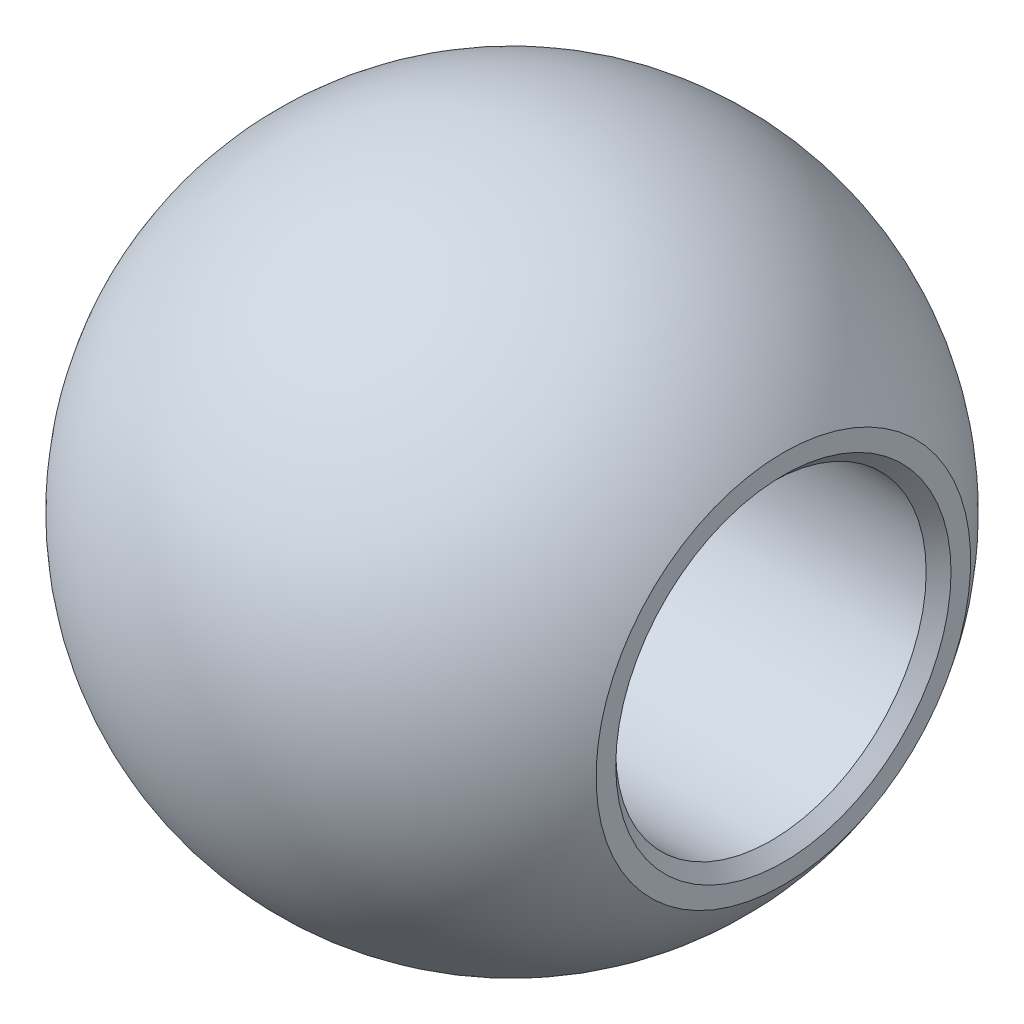
ISO-10303-21;
HEADER;
FILE_DESCRIPTION(('STEP AP214'),'2;1');
FILE_NAME('part.step','',(''),(''),'','','');
FILE_SCHEMA(('AUTOMOTIVE_DESIGN { 1 0 10303 214 1 1 1 1 }'));
ENDSEC;
DATA;
#1=APPLICATION_CONTEXT('core data for automotive mechanical design processes');
#2=APPLICATION_PROTOCOL_DEFINITION('international standard','automotive_design',2000,#1);
#3=PRODUCT_CONTEXT('',#1,'mechanical');
#4=PRODUCT('Part','Part','',(#3));
#5=PRODUCT_RELATED_PRODUCT_CATEGORY('part','',(#4));
#6=PRODUCT_DEFINITION_FORMATION('','',#4);
#7=PRODUCT_DEFINITION_CONTEXT('part definition',#1,'design');
#8=PRODUCT_DEFINITION('design','',#6,#7);
#9=PRODUCT_DEFINITION_SHAPE('','',#8);
#10=(LENGTH_UNIT() NAMED_UNIT(*) SI_UNIT(.MILLI.,.METRE.));
#11=(NAMED_UNIT(*) PLANE_ANGLE_UNIT() SI_UNIT($,.RADIAN.));
#12=(NAMED_UNIT(*) SI_UNIT($,.STERADIAN.) SOLID_ANGLE_UNIT());
#13=UNCERTAINTY_MEASURE_WITH_UNIT(LENGTH_MEASURE(1.E-05),#10,'distance_accuracy_value','');
#14=(GEOMETRIC_REPRESENTATION_CONTEXT(3) GLOBAL_UNCERTAINTY_ASSIGNED_CONTEXT((#13)) GLOBAL_UNIT_ASSIGNED_CONTEXT((#10,
#11,#12)) REPRESENTATION_CONTEXT('',''));
#15=CARTESIAN_POINT('',(0.,0.,0.));
#16=DIRECTION('',(0.,0.,1.));
#17=DIRECTION('',(1.,0.,0.));
#18=AXIS2_PLACEMENT_3D('',#15,#16,#17);
#19=CARTESIAN_POINT('',(0.,0.,0.));
#20=DIRECTION('',(-1.,0.,0.));
#21=DIRECTION('',(0.,1.,0.));
#22=AXIS2_PLACEMENT_3D('',#19,#20,#21);
#23=SPHERICAL_SURFACE('',#22,6.7437);
#24=CARTESIAN_POINT('',(-5.5499,0.,0.));
#25=DIRECTION('',(-1.,0.,0.));
#26=DIRECTION('',(0.,0.,1.));
#27=AXIS2_PLACEMENT_3D('',#24,#25,#26);
#28=CIRCLE('',#27,3.8309397907041);
#29=CARTESIAN_POINT('',(-5.5499,3.8309397907041,0.));
#30=VERTEX_POINT('',#29);
#31=EDGE_CURVE('E59',#30,#30,#28,.T.);
#32=CARTESIAN_POINT('',(5.5499,0.,0.));
#33=DIRECTION('',(-1.,0.,0.));
#34=DIRECTION('',(0.,0.,1.));
#35=AXIS2_PLACEMENT_3D('',#32,#33,#34);
#36=CIRCLE('',#35,3.8309397907041);
#37=CARTESIAN_POINT('',(5.5499,3.8309397907041,0.));
#38=VERTEX_POINT('',#37);
#39=EDGE_CURVE('E62',#38,#38,#36,.T.);
#40=CARTESIAN_POINT('',(-5.5499,3.8309397907041,0.));
#41=CARTESIAN_POINT('',(-5.4727563580062,3.94270758581667,0.));
#42=CARTESIAN_POINT('',(-5.39222826981805,4.05213850969361,0.));
#43=CARTESIAN_POINT('',(-5.22471561022084,4.26594188232622,0.));
#44=CARTESIAN_POINT('',(-5.13773103881179,4.37031433108189,0.));
#45=CARTESIAN_POINT('',(-4.95761782194057,4.57361602082191,0.));
#46=CARTESIAN_POINT('',(-4.86448917647841,4.67254526180626,0.));
#47=CARTESIAN_POINT('',(-4.67242895147228,4.86460061003431,0.));
#48=CARTESIAN_POINT('',(-4.57349737192832,4.95772671727801,0.));
#49=CARTESIAN_POINT('',(-4.37019190095427,5.13783572124541,0.));
#50=CARTESIAN_POINT('',(-4.26581800952419,5.22481861796911,0.));
#51=CARTESIAN_POINT('',(-4.05200884798757,5.39232389442358,0.));
#52=CARTESIAN_POINT('',(-3.94257357788104,5.47284627415435,0.));
#53=CARTESIAN_POINT('',(-3.71904093862403,5.62713668801631,0.));
#54=CARTESIAN_POINT('',(-3.60494356947355,5.7009047221475,0.));
#55=CARTESIAN_POINT('',(-3.37250305527703,5.84141728682265,0.));
#56=CARTESIAN_POINT('',(-3.25415991023099,5.90816181736661,0.));
#57=CARTESIAN_POINT('',(-3.01365965057782,6.03438383727262,0.));
#58=CARTESIAN_POINT('',(-2.89150253597068,6.09386132663467,0.));
#59=CARTESIAN_POINT('',(-2.64382006220428,6.20533224425174,0.));
#60=CARTESIAN_POINT('',(-2.51829470304502,6.25732567250675,0.));
#61=CARTESIAN_POINT('',(-2.26433375454288,6.35363875519149,0.));
#62=CARTESIAN_POINT('',(-2.13589816520001,6.3979584096212,0.));
#63=CARTESIAN_POINT('',(-1.87658538965847,6.47876223198589,0.));
#64=CARTESIAN_POINT('',(-1.7457082034598,6.51524639992086,0.));
#65=CARTESIAN_POINT('',(-1.48198977634088,6.58024612656285,0.));
#66=CARTESIAN_POINT('',(-1.34914853542062,6.60876168526986,0.));
#67=CARTESIAN_POINT('',(-1.08198670740964,6.65772014643928,0.));
#68=CARTESIAN_POINT('',(-0.947666120318912,6.67816304890168,0.));
#69=CARTESIAN_POINT('',(-0.678035706324531,6.71090160591451,0.));
#70=CARTESIAN_POINT('',(-0.54272587942088,6.72319726046496,0.));
#71=CARTESIAN_POINT('',(-0.271610701678153,6.7395964575077,0.));
#72=CARTESIAN_POINT('',(-0.135805350839076,6.7437,0.));
#73=CARTESIAN_POINT('',(0.135805350839076,6.7437,0.));
#74=CARTESIAN_POINT('',(0.271610701678152,6.7395964575077,0.));
#75=CARTESIAN_POINT('',(0.54272587942088,6.72319726046496,0.));
#76=CARTESIAN_POINT('',(0.678035706324531,6.71090160591451,0.));
#77=CARTESIAN_POINT('',(0.947666120318912,6.67816304890168,0.));
#78=CARTESIAN_POINT('',(1.08198670740964,6.65772014643928,0.));
#79=CARTESIAN_POINT('',(1.34914853542063,6.60876168526986,0.));
#80=CARTESIAN_POINT('',(1.48198977634088,6.58024612656285,0.));
#81=CARTESIAN_POINT('',(1.7457082034598,6.51524639992086,0.));
#82=CARTESIAN_POINT('',(1.87658538965847,6.47876223198589,0.));
#83=CARTESIAN_POINT('',(2.13589816520001,6.3979584096212,0.));
#84=CARTESIAN_POINT('',(2.26433375454288,6.35363875519149,0.));
#85=CARTESIAN_POINT('',(2.51829470304502,6.25732567250675,0.));
#86=CARTESIAN_POINT('',(2.64382006220428,6.20533224425174,0.));
#87=CARTESIAN_POINT('',(2.89150253597068,6.09386132663467,0.));
#88=CARTESIAN_POINT('',(3.01365965057782,6.03438383727262,0.));
#89=CARTESIAN_POINT('',(3.25415991023099,5.90816181736661,0.));
#90=CARTESIAN_POINT('',(3.37250305527703,5.84141728682265,0.));
#91=CARTESIAN_POINT('',(3.60494356947355,5.7009047221475,0.));
#92=CARTESIAN_POINT('',(3.71904093862403,5.62713668801631,0.));
#93=CARTESIAN_POINT('',(3.94257357788104,5.47284627415435,0.));
#94=CARTESIAN_POINT('',(4.05200884798757,5.39232389442358,0.));
#95=CARTESIAN_POINT('',(4.26581800952419,5.22481861796911,0.));
#96=CARTESIAN_POINT('',(4.37019190095427,5.13783572124541,0.));
#97=CARTESIAN_POINT('',(4.57349737192832,4.95772671727801,0.));
#98=CARTESIAN_POINT('',(4.67242895147228,4.86460061003431,0.));
#99=CARTESIAN_POINT('',(4.86448917647841,4.67254526180626,0.));
#100=CARTESIAN_POINT('',(4.95761782194057,4.57361602082191,0.));
#101=CARTESIAN_POINT('',(5.13773103881179,4.37031433108189,0.));
#102=CARTESIAN_POINT('',(5.22471561022084,4.26594188232622,0.));
#103=CARTESIAN_POINT('',(5.39222826981804,4.05213850969361,0.));
#104=CARTESIAN_POINT('',(5.4727563580062,3.94270758581667,0.));
#105=CARTESIAN_POINT('',(5.5499,3.8309397907041,0.));
#106=B_SPLINE_CURVE_WITH_KNOTS('',3,(#40,#41,#42,#43,#44,#45,#46,#47,#48,#49,#50,#51,#52,#53,
#54,#55,#56,#57,#58,#59,#60,#61,#62,#63,#64,#65,#66,#67,#68,#69,#70,#71,#72,#73,#74,#75,#76,#77,
#78,#79,#80,#81,#82,#83,#84,#85,#86,#87,#88,#89,#90,#91,#92,#93,#94,#95,#96,#97,#98,#99,#100,
#101,#102,#103,#104,#105),.UNSPECIFIED.,.F.,.F.,(4,2,2,2,2,2,2,2,2,2,2,2,2,2,2,2,2,2,2,2,2,2,2,
2,2,2,2,2,2,2,2,2,4),(0.,0.407354126170114,0.814708252340229,1.22206237851034,1.62941650468046,
2.03677063085057,2.44412475702069,2.8514788831908,3.25883300936092,3.66618713553103,
4.07354126170115,4.48089538787126,4.88824951404138,5.29560364021149,5.70295776638161,
6.11031189255172,6.51766601872184,6.92502014489195,7.33237427106207,7.73972839723218,
8.14708252340229,8.55443664957241,8.96179077574253,9.36914490191264,9.77649902808276,
10.1838531542529,10.591207280423,10.9985614065931,11.4059155327632,11.8132696589333,
12.2206237851034,12.6279779112736,13.0353320374437),.UNSPECIFIED.);
#107=EDGE_CURVE('BSEAM39',#30,#38,#106,.T.);
#108=ORIENTED_EDGE('',*,*,#31,.F.);
#109=ORIENTED_EDGE('',*,*,#39,.T.);
#110=ORIENTED_EDGE('',*,*,#107,.T.);
#111=ORIENTED_EDGE('',*,*,#107,.F.);
#112=EDGE_LOOP('',(#108,#110,#109,#111));
#113=FACE_BOUND('',#112,.T.);
#114=ADVANCED_FACE('F39',(#113),#23,.T.);
#115=CARTESIAN_POINT('',(-5.5499,3.8309397907041,0.));
#116=DIRECTION('',(1.,0.,0.));
#117=DIRECTION('',(0.,0.,-1.));
#118=AXIS2_PLACEMENT_3D('',#115,#116,#117);
#119=PLANE('',#118);
#120=CARTESIAN_POINT('',(-5.5499,0.,0.));
#121=DIRECTION('',(1.,0.,0.));
#122=DIRECTION('',(0.,0.,-1.));
#123=AXIS2_PLACEMENT_3D('',#120,#121,#122);
#124=CIRCLE('',#123,3.429);
#125=CARTESIAN_POINT('',(-5.5499,0.,-3.429));
#126=VERTEX_POINT('',#125);
#127=EDGE_CURVE('E46',#126,#126,#124,.T.);
#128=ORIENTED_EDGE('',*,*,#127,.T.);
#129=EDGE_LOOP('',(#128));
#130=FACE_BOUND('',#129,.T.);
#131=ORIENTED_EDGE('',*,*,#31,.T.);
#132=EDGE_LOOP('',(#131));
#133=FACE_BOUND('',#132,.T.);
#134=ADVANCED_FACE('F77',(#130,#133),#119,.F.);
#135=CARTESIAN_POINT('',(-6.88514664457328,0.,0.));
#136=DIRECTION('',(-1.,0.,0.));
#137=DIRECTION('',(0.,0.,1.));
#138=AXIS2_PLACEMENT_3D('',#135,#136,#137);
#139=CYLINDRICAL_SURFACE('',#138,3.175);
#140=CARTESIAN_POINT('',(-5.2959,0.,0.));
#141=DIRECTION('',(1.,0.,0.));
#142=DIRECTION('',(0.,0.,-1.));
#143=AXIS2_PLACEMENT_3D('',#140,#141,#142);
#144=CIRCLE('',#143,3.175);
#145=CARTESIAN_POINT('',(-5.2959,0.,-3.175));
#146=VERTEX_POINT('',#145);
#147=EDGE_CURVE('E50',#146,#146,#144,.F.);
#148=ORIENTED_EDGE('',*,*,#147,.T.);
#149=EDGE_LOOP('',(#148));
#150=FACE_BOUND('',#149,.T.);
#151=CARTESIAN_POINT('',(5.2959,0.,0.));
#152=DIRECTION('',(-1.,0.,0.));
#153=DIRECTION('',(0.,0.,1.));
#154=AXIS2_PLACEMENT_3D('',#151,#152,#153);
#155=CIRCLE('',#154,3.175);
#156=CARTESIAN_POINT('',(5.2959,0.,3.175));
#157=VERTEX_POINT('',#156);
#158=EDGE_CURVE('E54',#157,#157,#155,.F.);
#159=ORIENTED_EDGE('',*,*,#158,.T.);
#160=EDGE_LOOP('',(#159));
#161=FACE_BOUND('',#160,.T.);
#162=ADVANCED_FACE('F70',(#150,#161),#139,.F.);
#163=CARTESIAN_POINT('',(5.5499,3.175,0.));
#164=DIRECTION('',(-1.,0.,0.));
#165=DIRECTION('',(0.,0.,1.));
#166=AXIS2_PLACEMENT_3D('',#163,#164,#165);
#167=PLANE('',#166);
#168=CARTESIAN_POINT('',(5.5499,0.,0.));
#169=DIRECTION('',(-1.,0.,0.));
#170=DIRECTION('',(0.,0.,1.));
#171=AXIS2_PLACEMENT_3D('',#168,#169,#170);
#172=CIRCLE('',#171,3.429);
#173=CARTESIAN_POINT('',(5.5499,0.,3.429));
#174=VERTEX_POINT('',#173);
#175=EDGE_CURVE('E10',#174,#174,#172,.T.);
#176=ORIENTED_EDGE('',*,*,#175,.T.);
#177=EDGE_LOOP('',(#176));
#178=FACE_BOUND('',#177,.T.);
#179=ORIENTED_EDGE('',*,*,#39,.F.);
#180=EDGE_LOOP('',(#179));
#181=FACE_BOUND('',#180,.T.);
#182=ADVANCED_FACE('F67',(#178,#181),#167,.F.);
#183=CARTESIAN_POINT('',(-5.2959,0.,0.));
#184=DIRECTION('',(-1.,0.,0.));
#185=DIRECTION('',(0.,0.,1.));
#186=AXIS2_PLACEMENT_3D('',#183,#184,#185);
#187=CONICAL_SURFACE('',#186,3.175,0.785398163397451);
#188=ORIENTED_EDGE('',*,*,#127,.F.);
#189=EDGE_LOOP('',(#188));
#190=FACE_BOUND('',#189,.T.);
#191=ORIENTED_EDGE('',*,*,#147,.F.);
#192=EDGE_LOOP('',(#191));
#193=FACE_BOUND('',#192,.T.);
#194=ADVANCED_FACE('F69',(#190,#193),#187,.F.);
#195=CARTESIAN_POINT('',(5.5499,0.,0.));
#196=DIRECTION('',(1.,0.,0.));
#197=DIRECTION('',(0.,0.,-1.));
#198=AXIS2_PLACEMENT_3D('',#195,#196,#197);
#199=CONICAL_SURFACE('',#198,3.429,0.785398163397453);
#200=ORIENTED_EDGE('',*,*,#158,.F.);
#201=EDGE_LOOP('',(#200));
#202=FACE_BOUND('',#201,.T.);
#203=ORIENTED_EDGE('',*,*,#175,.F.);
#204=EDGE_LOOP('',(#203));
#205=FACE_BOUND('',#204,.T.);
#206=ADVANCED_FACE('F41',(#202,#205),#199,.F.);
#207=CLOSED_SHELL('',(#114,#134,#162,#182,#194,#206));
#208=MANIFOLD_SOLID_BREP('B2',#207);
#209=ADVANCED_BREP_SHAPE_REPRESENTATION('',(#18,#208),#14);
#210=SHAPE_DEFINITION_REPRESENTATION(#9,#209);
ENDSEC;
END-ISO-10303-21;
